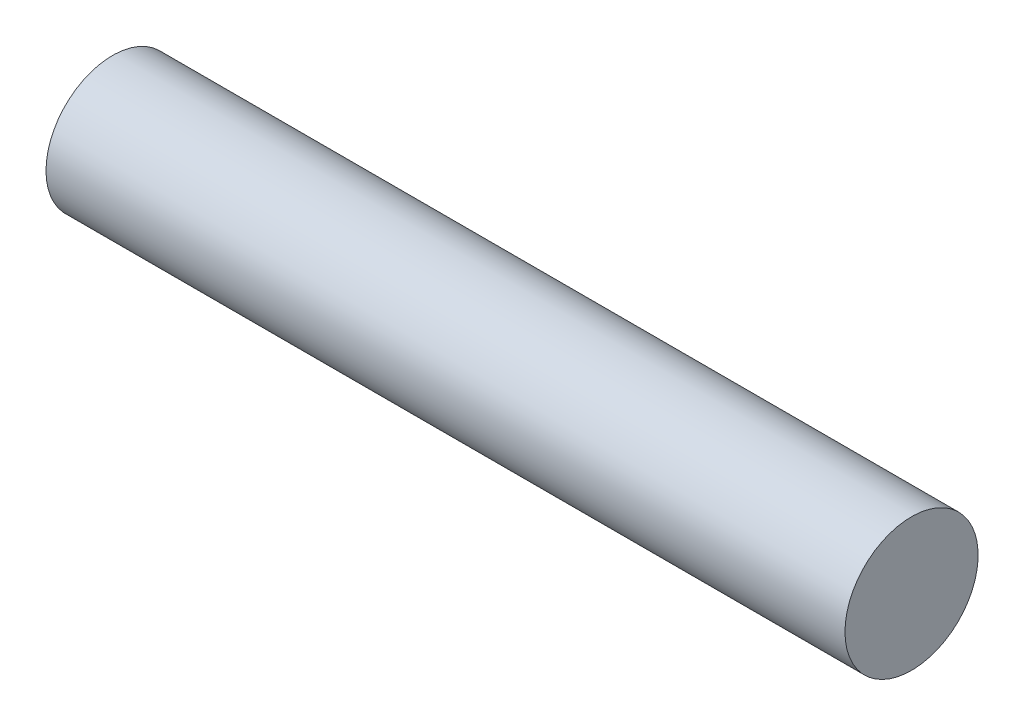
ISO-10303-21;
HEADER;
FILE_DESCRIPTION(('STEP AP214'),'2;1');
FILE_NAME('part.step','',(''),(''),'','','');
FILE_SCHEMA(('AUTOMOTIVE_DESIGN { 1 0 10303 214 1 1 1 1 }'));
ENDSEC;
DATA;
#1=APPLICATION_CONTEXT('core data for automotive mechanical design processes');
#2=APPLICATION_PROTOCOL_DEFINITION('international standard','automotive_design',2000,#1);
#3=PRODUCT_CONTEXT('',#1,'mechanical');
#4=PRODUCT('Part','Part','',(#3));
#5=PRODUCT_RELATED_PRODUCT_CATEGORY('part','',(#4));
#6=PRODUCT_DEFINITION_FORMATION('','',#4);
#7=PRODUCT_DEFINITION_CONTEXT('part definition',#1,'design');
#8=PRODUCT_DEFINITION('design','',#6,#7);
#9=PRODUCT_DEFINITION_SHAPE('','',#8);
#10=(LENGTH_UNIT() NAMED_UNIT(*) SI_UNIT(.MILLI.,.METRE.));
#11=(NAMED_UNIT(*) PLANE_ANGLE_UNIT() SI_UNIT($,.RADIAN.));
#12=(NAMED_UNIT(*) SI_UNIT($,.STERADIAN.) SOLID_ANGLE_UNIT());
#13=UNCERTAINTY_MEASURE_WITH_UNIT(LENGTH_MEASURE(1.E-05),#10,'distance_accuracy_value','');
#14=(GEOMETRIC_REPRESENTATION_CONTEXT(3) GLOBAL_UNCERTAINTY_ASSIGNED_CONTEXT((#13)) GLOBAL_UNIT_ASSIGNED_CONTEXT((#10,
#11,#12)) REPRESENTATION_CONTEXT('',''));
#15=CARTESIAN_POINT('',(0.,0.,0.));
#16=DIRECTION('',(0.,0.,1.));
#17=DIRECTION('',(1.,0.,0.));
#18=AXIS2_PLACEMENT_3D('',#15,#16,#17);
#19=CARTESIAN_POINT('',(38.1,0.,0.));
#20=DIRECTION('',(-1.,0.,0.));
#21=DIRECTION('',(0.,0.,1.));
#22=AXIS2_PLACEMENT_3D('',#19,#20,#21);
#23=CYLINDRICAL_SURFACE('',#22,3.175);
#24=CARTESIAN_POINT('',(38.1,0.,0.));
#25=DIRECTION('',(1.,0.,0.));
#26=DIRECTION('',(0.,0.,-1.));
#27=AXIS2_PLACEMENT_3D('',#24,#25,#26);
#28=CIRCLE('',#27,3.175);
#29=CARTESIAN_POINT('',(38.1,0.,3.175));
#30=VERTEX_POINT('',#29);
#31=EDGE_CURVE('E10',#30,#30,#28,.T.);
#32=CARTESIAN_POINT('',(0.,0.,0.));
#33=DIRECTION('',(1.,0.,0.));
#34=DIRECTION('',(0.,0.,-1.));
#35=AXIS2_PLACEMENT_3D('',#32,#33,#34);
#36=CIRCLE('',#35,3.175);
#37=CARTESIAN_POINT('',(0.,0.,3.175));
#38=VERTEX_POINT('',#37);
#39=EDGE_CURVE('E34',#38,#38,#36,.T.);
#40=CARTESIAN_POINT('',(38.1,0.,3.175));
#41=CARTESIAN_POINT('',(37.703125,0.,3.175));
#42=CARTESIAN_POINT('',(37.30625,0.,3.175));
#43=CARTESIAN_POINT('',(36.5125,0.,3.175));
#44=CARTESIAN_POINT('',(36.115625,0.,3.175));
#45=CARTESIAN_POINT('',(35.321875,0.,3.175));
#46=CARTESIAN_POINT('',(34.925,0.,3.175));
#47=CARTESIAN_POINT('',(34.13125,0.,3.175));
#48=CARTESIAN_POINT('',(33.734375,0.,3.175));
#49=CARTESIAN_POINT('',(32.940625,0.,3.175));
#50=CARTESIAN_POINT('',(32.54375,0.,3.175));
#51=CARTESIAN_POINT('',(31.75,0.,3.175));
#52=CARTESIAN_POINT('',(31.353125,0.,3.175));
#53=CARTESIAN_POINT('',(30.559375,0.,3.175));
#54=CARTESIAN_POINT('',(30.1625,0.,3.175));
#55=CARTESIAN_POINT('',(29.36875,0.,3.175));
#56=CARTESIAN_POINT('',(28.971875,0.,3.175));
#57=CARTESIAN_POINT('',(28.178125,0.,3.175));
#58=CARTESIAN_POINT('',(27.78125,0.,3.175));
#59=CARTESIAN_POINT('',(26.9875,0.,3.175));
#60=CARTESIAN_POINT('',(26.590625,0.,3.175));
#61=CARTESIAN_POINT('',(25.796875,0.,3.175));
#62=CARTESIAN_POINT('',(25.4,0.,3.175));
#63=CARTESIAN_POINT('',(24.60625,0.,3.175));
#64=CARTESIAN_POINT('',(24.209375,0.,3.175));
#65=CARTESIAN_POINT('',(23.415625,0.,3.175));
#66=CARTESIAN_POINT('',(23.01875,0.,3.175));
#67=CARTESIAN_POINT('',(22.225,0.,3.175));
#68=CARTESIAN_POINT('',(21.828125,0.,3.175));
#69=CARTESIAN_POINT('',(21.034375,0.,3.175));
#70=CARTESIAN_POINT('',(20.6375,0.,3.175));
#71=CARTESIAN_POINT('',(19.84375,0.,3.175));
#72=CARTESIAN_POINT('',(19.446875,0.,3.175));
#73=CARTESIAN_POINT('',(18.653125,0.,3.175));
#74=CARTESIAN_POINT('',(18.25625,0.,3.175));
#75=CARTESIAN_POINT('',(17.4625,0.,3.175));
#76=CARTESIAN_POINT('',(17.065625,0.,3.175));
#77=CARTESIAN_POINT('',(16.271875,0.,3.175));
#78=CARTESIAN_POINT('',(15.875,0.,3.175));
#79=CARTESIAN_POINT('',(15.08125,0.,3.175));
#80=CARTESIAN_POINT('',(14.684375,0.,3.175));
#81=CARTESIAN_POINT('',(13.890625,0.,3.175));
#82=CARTESIAN_POINT('',(13.49375,0.,3.175));
#83=CARTESIAN_POINT('',(12.7,0.,3.175));
#84=CARTESIAN_POINT('',(12.303125,0.,3.175));
#85=CARTESIAN_POINT('',(11.509375,0.,3.175));
#86=CARTESIAN_POINT('',(11.1125,0.,3.175));
#87=CARTESIAN_POINT('',(10.31875,0.,3.175));
#88=CARTESIAN_POINT('',(9.921875,0.,3.175));
#89=CARTESIAN_POINT('',(9.128125,0.,3.175));
#90=CARTESIAN_POINT('',(8.73125,0.,3.175));
#91=CARTESIAN_POINT('',(7.9375,0.,3.175));
#92=CARTESIAN_POINT('',(7.540625,0.,3.175));
#93=CARTESIAN_POINT('',(6.746875,0.,3.175));
#94=CARTESIAN_POINT('',(6.35,0.,3.175));
#95=CARTESIAN_POINT('',(5.55625,0.,3.175));
#96=CARTESIAN_POINT('',(5.159375,0.,3.175));
#97=CARTESIAN_POINT('',(4.365625,0.,3.175));
#98=CARTESIAN_POINT('',(3.96875,0.,3.175));
#99=CARTESIAN_POINT('',(3.175,0.,3.175));
#100=CARTESIAN_POINT('',(2.778125,0.,3.175));
#101=CARTESIAN_POINT('',(1.984375,0.,3.175));
#102=CARTESIAN_POINT('',(1.5875,0.,3.175));
#103=CARTESIAN_POINT('',(0.79375,0.,3.175));
#104=CARTESIAN_POINT('',(0.396875,0.,3.175));
#105=CARTESIAN_POINT('',(0.,0.,3.175));
#106=B_SPLINE_CURVE_WITH_KNOTS('',3,(#40,#41,#42,#43,#44,#45,#46,#47,#48,#49,#50,#51,#52,#53,
#54,#55,#56,#57,#58,#59,#60,#61,#62,#63,#64,#65,#66,#67,#68,#69,#70,#71,#72,#73,#74,#75,#76,#77,
#78,#79,#80,#81,#82,#83,#84,#85,#86,#87,#88,#89,#90,#91,#92,#93,#94,#95,#96,#97,#98,#99,#100,
#101,#102,#103,#104,#105),.UNSPECIFIED.,.F.,.F.,(4,2,2,2,2,2,2,2,2,2,2,2,2,2,2,2,2,2,2,2,2,2,2,
2,2,2,2,2,2,2,2,2,4),(0.,1.19062499999999,2.38124999999999,3.571875,4.7625,5.953125,7.14375,
8.33437499999999,9.525,10.715625,11.90625,13.096875,14.2875,15.478125,16.66875,17.859375,19.05,
20.240625,21.43125,22.621875,23.8125,25.003125,26.19375,27.384375,28.575,29.765625,30.95625,
32.146875,33.3375,34.528125,35.71875,36.909375,38.1),.UNSPECIFIED.);
#107=EDGE_CURVE('BSEAM31',#30,#38,#106,.T.);
#108=ORIENTED_EDGE('',*,*,#31,.F.);
#109=ORIENTED_EDGE('',*,*,#39,.T.);
#110=ORIENTED_EDGE('',*,*,#107,.T.);
#111=ORIENTED_EDGE('',*,*,#107,.F.);
#112=EDGE_LOOP('',(#108,#110,#109,#111));
#113=FACE_BOUND('',#112,.T.);
#114=ADVANCED_FACE('F31',(#113),#23,.T.);
#115=CARTESIAN_POINT('',(38.1,0.,0.));
#116=DIRECTION('',(1.,0.,0.));
#117=DIRECTION('',(0.,0.,-1.));
#118=AXIS2_PLACEMENT_3D('',#115,#116,#117);
#119=PLANE('',#118);
#120=ORIENTED_EDGE('',*,*,#31,.T.);
#121=EDGE_LOOP('',(#120));
#122=FACE_BOUND('',#121,.T.);
#123=ADVANCED_FACE('F46',(#122),#119,.T.);
#124=CARTESIAN_POINT('',(0.,0.,0.));
#125=DIRECTION('',(1.,0.,0.));
#126=DIRECTION('',(0.,0.,-1.));
#127=AXIS2_PLACEMENT_3D('',#124,#125,#126);
#128=PLANE('',#127);
#129=ORIENTED_EDGE('',*,*,#39,.F.);
#130=EDGE_LOOP('',(#129));
#131=FACE_BOUND('',#130,.T.);
#132=ADVANCED_FACE('F44',(#131),#128,.F.);
#133=CLOSED_SHELL('',(#114,#123,#132));
#134=MANIFOLD_SOLID_BREP('B2',#133);
#135=ADVANCED_BREP_SHAPE_REPRESENTATION('',(#18,#134),#14);
#136=SHAPE_DEFINITION_REPRESENTATION(#9,#135);
ENDSEC;
END-ISO-10303-21;
